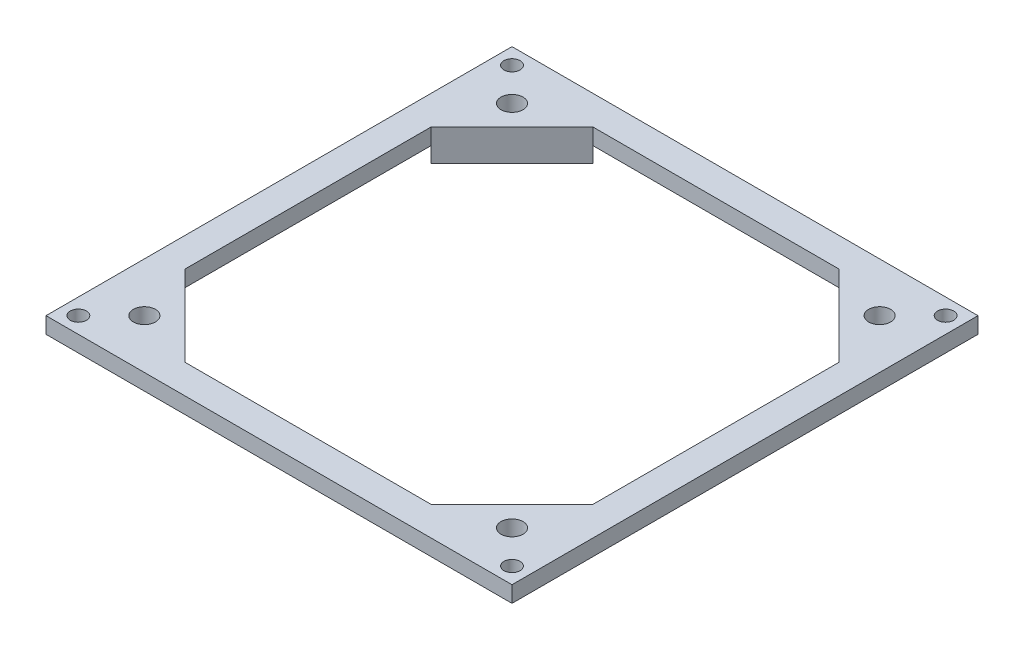
ISO-10303-21;
HEADER;
FILE_DESCRIPTION(('STEP AP214'),'2;1');
FILE_NAME('part.step','',(''),(''),'','','');
FILE_SCHEMA(('AUTOMOTIVE_DESIGN { 1 0 10303 214 1 1 1 1 }'));
ENDSEC;
DATA;
#1=APPLICATION_CONTEXT('core data for automotive mechanical design processes');
#2=APPLICATION_PROTOCOL_DEFINITION('international standard','automotive_design',2000,#1);
#3=PRODUCT_CONTEXT('',#1,'mechanical');
#4=PRODUCT('Part','Part','',(#3));
#5=PRODUCT_RELATED_PRODUCT_CATEGORY('part','',(#4));
#6=PRODUCT_DEFINITION_FORMATION('','',#4);
#7=PRODUCT_DEFINITION_CONTEXT('part definition',#1,'design');
#8=PRODUCT_DEFINITION('design','',#6,#7);
#9=PRODUCT_DEFINITION_SHAPE('','',#8);
#10=(LENGTH_UNIT() NAMED_UNIT(*) SI_UNIT(.MILLI.,.METRE.));
#11=(NAMED_UNIT(*) PLANE_ANGLE_UNIT() SI_UNIT($,.RADIAN.));
#12=(NAMED_UNIT(*) SI_UNIT($,.STERADIAN.) SOLID_ANGLE_UNIT());
#13=UNCERTAINTY_MEASURE_WITH_UNIT(LENGTH_MEASURE(1.E-05),#10,'distance_accuracy_value','');
#14=(GEOMETRIC_REPRESENTATION_CONTEXT(3) GLOBAL_UNCERTAINTY_ASSIGNED_CONTEXT((#13)) GLOBAL_UNIT_ASSIGNED_CONTEXT((#10,
#11,#12)) REPRESENTATION_CONTEXT('',''));
#15=CARTESIAN_POINT('',(0.,0.,0.));
#16=DIRECTION('',(0.,0.,1.));
#17=DIRECTION('',(1.,0.,0.));
#18=AXIS2_PLACEMENT_3D('',#15,#16,#17);
#19=CARTESIAN_POINT('',(40.005,-3.048,-40.005));
#20=DIRECTION('',(-1.,0.,0.));
#21=DIRECTION('',(0.,0.,1.));
#22=AXIS2_PLACEMENT_3D('',#19,#20,#21);
#23=PLANE('',#22);
#24=DIRECTION('',(0.,0.,1.));
#25=VECTOR('',#24,1.);
#26=CARTESIAN_POINT('',(40.005,0.,-40.005));
#27=LINE('',#26,#25);
#28=CARTESIAN_POINT('',(40.005,0.,24.13));
#29=VERTEX_POINT('',#28);
#30=CARTESIAN_POINT('',(40.005,0.,37.465));
#31=VERTEX_POINT('',#30);
#32=EDGE_CURVE('E319',#29,#31,#27,.T.);
#33=ORIENTED_EDGE('',*,*,#32,.T.);
#34=DIRECTION('',(0.,1.,0.));
#35=VECTOR('',#34,1.);
#36=CARTESIAN_POINT('',(40.005,-3.048,37.465));
#37=LINE('',#36,#35);
#38=CARTESIAN_POINT('',(40.005,-3.048,37.465));
#39=VERTEX_POINT('',#38);
#40=EDGE_CURVE('E417',#31,#39,#37,.F.);
#41=ORIENTED_EDGE('',*,*,#40,.T.);
#42=DIRECTION('',(0.,0.,1.));
#43=VECTOR('',#42,1.);
#44=CARTESIAN_POINT('',(40.005,-3.048,-40.005));
#45=LINE('',#44,#43);
#46=CARTESIAN_POINT('',(40.005,-3.048,24.13));
#47=VERTEX_POINT('',#46);
#48=EDGE_CURVE('E324',#47,#39,#45,.T.);
#49=ORIENTED_EDGE('',*,*,#48,.F.);
#50=DIRECTION('',(0.,-1.,0.));
#51=VECTOR('',#50,1.);
#52=CARTESIAN_POINT('',(40.005,3.175,24.13));
#53=LINE('',#52,#51);
#54=EDGE_CURVE('E286',#29,#47,#53,.T.);
#55=ORIENTED_EDGE('',*,*,#54,.F.);
#56=EDGE_LOOP('',(#33,#41,#49,#55));
#57=FACE_BOUND('',#56,.T.);
#58=ADVANCED_FACE('F39',(#57),#23,.F.);
#59=CARTESIAN_POINT('',(-40.005,-3.048,40.005));
#60=DIRECTION('',(0.,0.,-1.));
#61=DIRECTION('',(-1.,0.,0.));
#62=AXIS2_PLACEMENT_3D('',#59,#60,#61);
#63=PLANE('',#62);
#64=DIRECTION('',(-1.,0.,0.));
#65=VECTOR('',#64,1.);
#66=CARTESIAN_POINT('',(-40.005,-3.048,40.005));
#67=LINE('',#66,#65);
#68=CARTESIAN_POINT('',(37.465,-3.048,40.005));
#69=VERTEX_POINT('',#68);
#70=CARTESIAN_POINT('',(24.13,-3.048,40.005));
#71=VERTEX_POINT('',#70);
#72=EDGE_CURVE('E325',#69,#71,#67,.T.);
#73=ORIENTED_EDGE('',*,*,#72,.F.);
#74=DIRECTION('',(0.,1.,0.));
#75=VECTOR('',#74,1.);
#76=CARTESIAN_POINT('',(37.465,-3.048,40.005));
#77=LINE('',#76,#75);
#78=CARTESIAN_POINT('',(37.465,0.,40.005));
#79=VERTEX_POINT('',#78);
#80=EDGE_CURVE('E413',#69,#79,#77,.T.);
#81=ORIENTED_EDGE('',*,*,#80,.T.);
#82=DIRECTION('',(-1.,0.,0.));
#83=VECTOR('',#82,1.);
#84=CARTESIAN_POINT('',(-40.005,0.,40.005));
#85=LINE('',#84,#83);
#86=CARTESIAN_POINT('',(24.13,0.,40.005));
#87=VERTEX_POINT('',#86);
#88=EDGE_CURVE('E341',#79,#87,#85,.T.);
#89=ORIENTED_EDGE('',*,*,#88,.T.);
#90=DIRECTION('',(0.,-1.,0.));
#91=VECTOR('',#90,1.);
#92=CARTESIAN_POINT('',(24.13,3.175,40.005));
#93=LINE('',#92,#91);
#94=EDGE_CURVE('E281',#87,#71,#93,.T.);
#95=ORIENTED_EDGE('',*,*,#94,.T.);
#96=EDGE_LOOP('',(#73,#81,#89,#95));
#97=FACE_BOUND('',#96,.T.);
#98=ADVANCED_FACE('F568',(#97),#63,.F.);
#99=CARTESIAN_POINT('',(-40.005,-3.048,-40.005));
#100=DIRECTION('',(1.,0.,0.));
#101=DIRECTION('',(0.,0.,-1.));
#102=AXIS2_PLACEMENT_3D('',#99,#100,#101);
#103=PLANE('',#102);
#104=DIRECTION('',(0.,0.,-1.));
#105=VECTOR('',#104,1.);
#106=CARTESIAN_POINT('',(-40.005,0.,-40.005));
#107=LINE('',#106,#105);
#108=CARTESIAN_POINT('',(-40.005,0.,-24.13));
#109=VERTEX_POINT('',#108);
#110=CARTESIAN_POINT('',(-40.005,0.,-37.465));
#111=VERTEX_POINT('',#110);
#112=EDGE_CURVE('E344',#109,#111,#107,.T.);
#113=ORIENTED_EDGE('',*,*,#112,.T.);
#114=DIRECTION('',(0.,1.,0.));
#115=VECTOR('',#114,1.);
#116=CARTESIAN_POINT('',(-40.005,-3.048,-37.465));
#117=LINE('',#116,#115);
#118=CARTESIAN_POINT('',(-40.005,-3.048,-37.465));
#119=VERTEX_POINT('',#118);
#120=EDGE_CURVE('E397',#111,#119,#117,.F.);
#121=ORIENTED_EDGE('',*,*,#120,.T.);
#122=DIRECTION('',(0.,0.,-1.));
#123=VECTOR('',#122,1.);
#124=CARTESIAN_POINT('',(-40.005,-3.048,-40.005));
#125=LINE('',#124,#123);
#126=CARTESIAN_POINT('',(-40.005,-3.048,-24.13));
#127=VERTEX_POINT('',#126);
#128=EDGE_CURVE('E328',#127,#119,#125,.T.);
#129=ORIENTED_EDGE('',*,*,#128,.F.);
#130=DIRECTION('',(0.,-1.,0.));
#131=VECTOR('',#130,1.);
#132=CARTESIAN_POINT('',(-40.005,3.175,-24.13));
#133=LINE('',#132,#131);
#134=EDGE_CURVE('E306',#109,#127,#133,.T.);
#135=ORIENTED_EDGE('',*,*,#134,.F.);
#136=EDGE_LOOP('',(#113,#121,#129,#135));
#137=FACE_BOUND('',#136,.T.);
#138=ADVANCED_FACE('F583',(#137),#103,.F.);
#139=CARTESIAN_POINT('',(-40.005,-3.048,-40.005));
#140=DIRECTION('',(0.,0.,1.));
#141=DIRECTION('',(1.,0.,0.));
#142=AXIS2_PLACEMENT_3D('',#139,#140,#141);
#143=PLANE('',#142);
#144=DIRECTION('',(1.,0.,0.));
#145=VECTOR('',#144,1.);
#146=CARTESIAN_POINT('',(-40.005,0.,-40.005));
#147=LINE('',#146,#145);
#148=CARTESIAN_POINT('',(24.13,0.,-40.005));
#149=VERTEX_POINT('',#148);
#150=CARTESIAN_POINT('',(37.465,0.,-40.005));
#151=VERTEX_POINT('',#150);
#152=EDGE_CURVE('E348',#149,#151,#147,.T.);
#153=ORIENTED_EDGE('',*,*,#152,.T.);
#154=DIRECTION('',(0.,1.,0.));
#155=VECTOR('',#154,1.);
#156=CARTESIAN_POINT('',(37.465,-3.048,-40.005));
#157=LINE('',#156,#155);
#158=CARTESIAN_POINT('',(37.465,-3.048,-40.005));
#159=VERTEX_POINT('',#158);
#160=EDGE_CURVE('E407',#151,#159,#157,.F.);
#161=ORIENTED_EDGE('',*,*,#160,.T.);
#162=DIRECTION('',(1.,0.,0.));
#163=VECTOR('',#162,1.);
#164=CARTESIAN_POINT('',(-40.005,-3.048,-40.005));
#165=LINE('',#164,#163);
#166=CARTESIAN_POINT('',(24.13,-3.048,-40.005));
#167=VERTEX_POINT('',#166);
#168=EDGE_CURVE('E332',#167,#159,#165,.T.);
#169=ORIENTED_EDGE('',*,*,#168,.F.);
#170=DIRECTION('',(0.,-1.,0.));
#171=VECTOR('',#170,1.);
#172=CARTESIAN_POINT('',(24.13,3.175,-40.005));
#173=LINE('',#172,#171);
#174=EDGE_CURVE('E296',#149,#167,#173,.T.);
#175=ORIENTED_EDGE('',*,*,#174,.F.);
#176=EDGE_LOOP('',(#153,#161,#169,#175));
#177=FACE_BOUND('',#176,.T.);
#178=ADVANCED_FACE('F603',(#177),#143,.F.);
#179=CARTESIAN_POINT('',(0.,-3.048,0.));
#180=DIRECTION('',(0.,1.,0.));
#181=DIRECTION('',(0.,0.,1.));
#182=AXIS2_PLACEMENT_3D('',#179,#180,#181);
#183=PLANE('',#182);
#184=CARTESIAN_POINT('',(36.068,-3.048,36.068000000001));
#185=DIRECTION('',(0.,-1.,0.));
#186=DIRECTION('',(0.,0.,-1.));
#187=AXIS2_PLACEMENT_3D('',#184,#185,#186);
#188=CIRCLE('',#187,2.15900000000114);
#189=CARTESIAN_POINT('',(36.068,-3.048,33.9089999999999));
#190=VERTEX_POINT('',#189);
#191=EDGE_CURVE('E480',#190,#190,#188,.T.);
#192=ORIENTED_EDGE('',*,*,#191,.F.);
#193=EDGE_LOOP('',(#192));
#194=FACE_BOUND('',#193,.T.);
#195=ORIENTED_EDGE('',*,*,#48,.T.);
#196=CARTESIAN_POINT('',(37.465,-3.048,37.465));
#197=DIRECTION('',(0.,1.,0.));
#198=DIRECTION('',(0.,0.,1.));
#199=AXIS2_PLACEMENT_3D('',#196,#197,#198);
#200=CIRCLE('',#199,2.54);
#201=EDGE_CURVE('E420',#39,#69,#200,.F.);
#202=ORIENTED_EDGE('',*,*,#201,.T.);
#203=ORIENTED_EDGE('',*,*,#72,.T.);
#204=DIRECTION('',(-0.707106781186548,0.,0.707106781186548));
#205=VECTOR('',#204,1.);
#206=CARTESIAN_POINT('',(40.005,-3.048,24.13));
#207=LINE('',#206,#205);
#208=EDGE_CURVE('E237',#47,#71,#207,.T.);
#209=ORIENTED_EDGE('',*,*,#208,.F.);
#210=EDGE_LOOP('',(#195,#202,#203,#209));
#211=FACE_BOUND('',#210,.T.);
#212=ADVANCED_FACE('F503',(#194,#211),#183,.F.);
#213=CARTESIAN_POINT('',(36.068000000001,-3.048,-36.067999999999));
#214=DIRECTION('',(0.,-1.,0.));
#215=DIRECTION('',(0.,0.,-1.));
#216=AXIS2_PLACEMENT_3D('',#213,#214,#215);
#217=CIRCLE('',#216,2.15900000000161);
#218=CARTESIAN_POINT('',(36.068000000001,-3.048,-38.2270000000006));
#219=VERTEX_POINT('',#218);
#220=EDGE_CURVE('E466',#219,#219,#217,.T.);
#221=ORIENTED_EDGE('',*,*,#220,.F.);
#222=EDGE_LOOP('',(#221));
#223=FACE_BOUND('',#222,.T.);
#224=ORIENTED_EDGE('',*,*,#168,.T.);
#225=CARTESIAN_POINT('',(37.465,-3.048,-37.465));
#226=DIRECTION('',(0.,1.,0.));
#227=DIRECTION('',(0.,0.,1.));
#228=AXIS2_PLACEMENT_3D('',#225,#226,#227);
#229=CIRCLE('',#228,2.54);
#230=CARTESIAN_POINT('',(40.005,-3.048,-37.465));
#231=VERTEX_POINT('',#230);
#232=EDGE_CURVE('E410',#159,#231,#229,.F.);
#233=ORIENTED_EDGE('',*,*,#232,.T.);
#234=CARTESIAN_POINT('',(40.005,-3.048,-24.13));
#235=VERTEX_POINT('',#234);
#236=EDGE_CURVE('E320',#231,#235,#45,.T.);
#237=ORIENTED_EDGE('',*,*,#236,.T.);
#238=DIRECTION('',(0.707106781186548,0.,0.707106781186548));
#239=VECTOR('',#238,1.);
#240=CARTESIAN_POINT('',(24.13,-3.048,-40.005));
#241=LINE('',#240,#239);
#242=EDGE_CURVE('E241',#167,#235,#241,.T.);
#243=ORIENTED_EDGE('',*,*,#242,.F.);
#244=EDGE_LOOP('',(#224,#233,#237,#243));
#245=FACE_BOUND('',#244,.T.);
#246=ADVANCED_FACE('F499',(#223,#245),#183,.F.);
#247=CARTESIAN_POINT('',(-36.067999999999,-3.048,-36.068));
#248=DIRECTION('',(0.,-1.,0.));
#249=DIRECTION('',(0.,0.,-1.));
#250=AXIS2_PLACEMENT_3D('',#247,#248,#249);
#251=CIRCLE('',#250,2.15900000000077);
#252=CARTESIAN_POINT('',(-36.067999999999,-3.048,-38.2270000000007));
#253=VERTEX_POINT('',#252);
#254=EDGE_CURVE('E455',#253,#253,#251,.T.);
#255=ORIENTED_EDGE('',*,*,#254,.F.);
#256=EDGE_LOOP('',(#255));
#257=FACE_BOUND('',#256,.T.);
#258=ORIENTED_EDGE('',*,*,#128,.T.);
#259=CARTESIAN_POINT('',(-37.465,-3.048,-37.465));
#260=DIRECTION('',(0.,1.,0.));
#261=DIRECTION('',(0.,0.,1.));
#262=AXIS2_PLACEMENT_3D('',#259,#260,#261);
#263=CIRCLE('',#262,2.54);
#264=CARTESIAN_POINT('',(-37.465,-3.048,-40.005));
#265=VERTEX_POINT('',#264);
#266=EDGE_CURVE('E400',#119,#265,#263,.F.);
#267=ORIENTED_EDGE('',*,*,#266,.T.);
#268=CARTESIAN_POINT('',(-24.13,-3.048,-40.005));
#269=VERTEX_POINT('',#268);
#270=EDGE_CURVE('E333',#265,#269,#165,.T.);
#271=ORIENTED_EDGE('',*,*,#270,.T.);
#272=DIRECTION('',(0.707106781186548,0.,-0.707106781186547));
#273=VECTOR('',#272,1.);
#274=CARTESIAN_POINT('',(-40.005,-3.048,-24.13));
#275=LINE('',#274,#273);
#276=EDGE_CURVE('E269',#127,#269,#275,.T.);
#277=ORIENTED_EDGE('',*,*,#276,.F.);
#278=EDGE_LOOP('',(#258,#267,#271,#277));
#279=FACE_BOUND('',#278,.T.);
#280=ADVANCED_FACE('F502',(#257,#279),#183,.F.);
#281=CARTESIAN_POINT('',(45.72,3.175,45.72));
#282=DIRECTION('',(-1.,0.,0.));
#283=DIRECTION('',(0.,0.,1.));
#284=AXIS2_PLACEMENT_3D('',#281,#282,#283);
#285=PLANE('',#284);
#286=DIRECTION('',(0.,0.,-1.));
#287=VECTOR('',#286,1.);
#288=CARTESIAN_POINT('',(45.72,0.,45.72));
#289=LINE('',#288,#287);
#290=CARTESIAN_POINT('',(45.72,0.,45.72));
#291=VERTEX_POINT('',#290);
#292=CARTESIAN_POINT('',(45.72,0.,-45.72));
#293=VERTEX_POINT('',#292);
#294=EDGE_CURVE('E336',#291,#293,#289,.T.);
#295=ORIENTED_EDGE('',*,*,#294,.T.);
#296=DIRECTION('',(0.,-1.,0.));
#297=VECTOR('',#296,1.);
#298=CARTESIAN_POINT('',(45.72,3.175,-45.72));
#299=LINE('',#298,#297);
#300=CARTESIAN_POINT('',(45.72,3.175,-45.72));
#301=VERTEX_POINT('',#300);
#302=EDGE_CURVE('E389',#301,#293,#299,.T.);
#303=ORIENTED_EDGE('',*,*,#302,.F.);
#304=DIRECTION('',(0.,0.,-1.));
#305=VECTOR('',#304,1.);
#306=CARTESIAN_POINT('',(45.72,3.175,45.72));
#307=LINE('',#306,#305);
#308=CARTESIAN_POINT('',(45.72,3.175,45.72));
#309=VERTEX_POINT('',#308);
#310=EDGE_CURVE('E352',#309,#301,#307,.T.);
#311=ORIENTED_EDGE('',*,*,#310,.F.);
#312=DIRECTION('',(0.,-1.,0.));
#313=VECTOR('',#312,1.);
#314=CARTESIAN_POINT('',(45.72,3.175,45.72));
#315=LINE('',#314,#313);
#316=EDGE_CURVE('E366',#309,#291,#315,.T.);
#317=ORIENTED_EDGE('',*,*,#316,.T.);
#318=EDGE_LOOP('',(#295,#303,#311,#317));
#319=FACE_BOUND('',#318,.T.);
#320=ADVANCED_FACE('F646',(#319),#285,.F.);
#321=CARTESIAN_POINT('',(-45.72,3.175,-45.72));
#322=DIRECTION('',(0.,0.,1.));
#323=DIRECTION('',(1.,0.,0.));
#324=AXIS2_PLACEMENT_3D('',#321,#322,#323);
#325=PLANE('',#324);
#326=DIRECTION('',(-1.,0.,0.));
#327=VECTOR('',#326,1.);
#328=CARTESIAN_POINT('',(-45.72,0.,-45.72));
#329=LINE('',#328,#327);
#330=CARTESIAN_POINT('',(-45.72,0.,-45.72));
#331=VERTEX_POINT('',#330);
#332=EDGE_CURVE('E370',#293,#331,#329,.T.);
#333=ORIENTED_EDGE('',*,*,#332,.T.);
#334=DIRECTION('',(0.,-1.,0.));
#335=VECTOR('',#334,1.);
#336=CARTESIAN_POINT('',(-45.72,3.175,-45.72));
#337=LINE('',#336,#335);
#338=CARTESIAN_POINT('',(-45.72,3.175,-45.72));
#339=VERTEX_POINT('',#338);
#340=EDGE_CURVE('E385',#339,#331,#337,.T.);
#341=ORIENTED_EDGE('',*,*,#340,.F.);
#342=DIRECTION('',(-1.,0.,0.));
#343=VECTOR('',#342,1.);
#344=CARTESIAN_POINT('',(-45.72,3.175,-45.72));
#345=LINE('',#344,#343);
#346=EDGE_CURVE('E356',#301,#339,#345,.T.);
#347=ORIENTED_EDGE('',*,*,#346,.F.);
#348=ORIENTED_EDGE('',*,*,#302,.T.);
#349=EDGE_LOOP('',(#333,#341,#347,#348));
#350=FACE_BOUND('',#349,.T.);
#351=ADVANCED_FACE('F642',(#350),#325,.F.);
#352=CARTESIAN_POINT('',(-45.72,3.175,45.72));
#353=DIRECTION('',(1.,0.,0.));
#354=DIRECTION('',(0.,0.,-1.));
#355=AXIS2_PLACEMENT_3D('',#352,#353,#354);
#356=PLANE('',#355);
#357=DIRECTION('',(0.,0.,1.));
#358=VECTOR('',#357,1.);
#359=CARTESIAN_POINT('',(-45.72,0.,45.72));
#360=LINE('',#359,#358);
#361=CARTESIAN_POINT('',(-45.72,0.,45.72));
#362=VERTEX_POINT('',#361);
#363=EDGE_CURVE('E373',#331,#362,#360,.T.);
#364=ORIENTED_EDGE('',*,*,#363,.T.);
#365=DIRECTION('',(0.,-1.,0.));
#366=VECTOR('',#365,1.);
#367=CARTESIAN_POINT('',(-45.72,3.175,45.72));
#368=LINE('',#367,#366);
#369=CARTESIAN_POINT('',(-45.72,3.175,45.72));
#370=VERTEX_POINT('',#369);
#371=EDGE_CURVE('E381',#370,#362,#368,.T.);
#372=ORIENTED_EDGE('',*,*,#371,.F.);
#373=DIRECTION('',(0.,0.,1.));
#374=VECTOR('',#373,1.);
#375=CARTESIAN_POINT('',(-45.72,3.175,45.72));
#376=LINE('',#375,#374);
#377=EDGE_CURVE('E360',#339,#370,#376,.T.);
#378=ORIENTED_EDGE('',*,*,#377,.F.);
#379=ORIENTED_EDGE('',*,*,#340,.T.);
#380=EDGE_LOOP('',(#364,#372,#378,#379));
#381=FACE_BOUND('',#380,.T.);
#382=ADVANCED_FACE('F638',(#381),#356,.F.);
#383=CARTESIAN_POINT('',(-45.72,3.175,45.72));
#384=DIRECTION('',(0.,0.,-1.));
#385=DIRECTION('',(-1.,0.,0.));
#386=AXIS2_PLACEMENT_3D('',#383,#384,#385);
#387=PLANE('',#386);
#388=DIRECTION('',(1.,0.,0.));
#389=VECTOR('',#388,1.);
#390=CARTESIAN_POINT('',(-45.72,0.,45.72));
#391=LINE('',#390,#389);
#392=EDGE_CURVE('E357',#362,#291,#391,.T.);
#393=ORIENTED_EDGE('',*,*,#392,.T.);
#394=ORIENTED_EDGE('',*,*,#316,.F.);
#395=DIRECTION('',(1.,0.,0.));
#396=VECTOR('',#395,1.);
#397=CARTESIAN_POINT('',(-45.72,3.175,45.72));
#398=LINE('',#397,#396);
#399=EDGE_CURVE('E363',#370,#309,#398,.T.);
#400=ORIENTED_EDGE('',*,*,#399,.F.);
#401=ORIENTED_EDGE('',*,*,#371,.T.);
#402=EDGE_LOOP('',(#393,#394,#400,#401));
#403=FACE_BOUND('',#402,.T.);
#404=ADVANCED_FACE('F632',(#403),#387,.F.);
#405=CARTESIAN_POINT('',(0.,3.175,0.));
#406=DIRECTION('',(0.,-1.,0.));
#407=DIRECTION('',(0.,0.,-1.));
#408=AXIS2_PLACEMENT_3D('',#405,#406,#407);
#409=PLANE('',#408);
#410=CARTESIAN_POINT('',(-42.545,3.175,42.545));
#411=DIRECTION('',(0.,1.,0.));
#412=DIRECTION('',(0.,0.,1.));
#413=AXIS2_PLACEMENT_3D('',#410,#411,#412);
#414=CIRCLE('',#413,1.5875);
#415=CARTESIAN_POINT('',(-42.545,3.175,44.1325));
#416=VERTEX_POINT('',#415);
#417=EDGE_CURVE('E931',#416,#416,#414,.T.);
#418=ORIENTED_EDGE('',*,*,#417,.F.);
#419=EDGE_LOOP('',(#418));
#420=FACE_BOUND('',#419,.T.);
#421=CARTESIAN_POINT('',(42.545,3.175,42.545));
#422=DIRECTION('',(0.,1.,0.));
#423=DIRECTION('',(0.,0.,1.));
#424=AXIS2_PLACEMENT_3D('',#421,#422,#423);
#425=CIRCLE('',#424,1.5875);
#426=CARTESIAN_POINT('',(42.545,3.175,44.1325));
#427=VERTEX_POINT('',#426);
#428=EDGE_CURVE('E933',#427,#427,#425,.T.);
#429=ORIENTED_EDGE('',*,*,#428,.F.);
#430=EDGE_LOOP('',(#429));
#431=FACE_BOUND('',#430,.T.);
#432=CARTESIAN_POINT('',(42.545,3.175,-42.545));
#433=DIRECTION('',(0.,1.,0.));
#434=DIRECTION('',(0.,0.,1.));
#435=AXIS2_PLACEMENT_3D('',#432,#433,#434);
#436=CIRCLE('',#435,1.5875);
#437=CARTESIAN_POINT('',(42.545,3.175,-40.9575));
#438=VERTEX_POINT('',#437);
#439=EDGE_CURVE('E936',#438,#438,#436,.T.);
#440=ORIENTED_EDGE('',*,*,#439,.F.);
#441=EDGE_LOOP('',(#440));
#442=FACE_BOUND('',#441,.T.);
#443=CARTESIAN_POINT('',(-42.545,3.175,-42.545));
#444=DIRECTION('',(0.,1.,0.));
#445=DIRECTION('',(0.,0.,1.));
#446=AXIS2_PLACEMENT_3D('',#443,#444,#445);
#447=CIRCLE('',#446,1.5875);
#448=CARTESIAN_POINT('',(-42.545,3.175,-40.9575));
#449=VERTEX_POINT('',#448);
#450=EDGE_CURVE('E445',#449,#449,#447,.T.);
#451=ORIENTED_EDGE('',*,*,#450,.F.);
#452=EDGE_LOOP('',(#451));
#453=FACE_BOUND('',#452,.T.);
#454=CARTESIAN_POINT('',(-36.067999999999,3.175,-36.068));
#455=DIRECTION('',(0.,-1.,0.));
#456=DIRECTION('',(0.,0.,-1.));
#457=AXIS2_PLACEMENT_3D('',#454,#455,#456);
#458=CIRCLE('',#457,2.15900000000077);
#459=CARTESIAN_POINT('',(-36.067999999999,3.175,-38.2270000000007));
#460=VERTEX_POINT('',#459);
#461=EDGE_CURVE('E460',#460,#460,#458,.T.);
#462=ORIENTED_EDGE('',*,*,#461,.T.);
#463=EDGE_LOOP('',(#462));
#464=FACE_BOUND('',#463,.T.);
#465=CARTESIAN_POINT('',(36.068000000001,3.175,-36.067999999999));
#466=DIRECTION('',(0.,-1.,0.));
#467=DIRECTION('',(0.,0.,-1.));
#468=AXIS2_PLACEMENT_3D('',#465,#466,#467);
#469=CIRCLE('',#468,2.15900000000161);
#470=CARTESIAN_POINT('',(36.068000000001,3.175,-38.2270000000006));
#471=VERTEX_POINT('',#470);
#472=EDGE_CURVE('E486',#471,#471,#469,.T.);
#473=ORIENTED_EDGE('',*,*,#472,.T.);
#474=EDGE_LOOP('',(#473));
#475=FACE_BOUND('',#474,.T.);
#476=CARTESIAN_POINT('',(36.068,3.175,36.068000000001));
#477=DIRECTION('',(0.,-1.,0.));
#478=DIRECTION('',(0.,0.,-1.));
#479=AXIS2_PLACEMENT_3D('',#476,#477,#478);
#480=CIRCLE('',#479,2.15900000000114);
#481=CARTESIAN_POINT('',(36.068,3.175,33.9089999999999));
#482=VERTEX_POINT('',#481);
#483=EDGE_CURVE('E475',#482,#482,#480,.T.);
#484=ORIENTED_EDGE('',*,*,#483,.T.);
#485=EDGE_LOOP('',(#484));
#486=FACE_BOUND('',#485,.T.);
#487=CARTESIAN_POINT('',(-36.068,3.175,36.068));
#488=DIRECTION('',(0.,-1.,0.));
#489=DIRECTION('',(0.,0.,-1.));
#490=AXIS2_PLACEMENT_3D('',#487,#488,#489);
#491=CIRCLE('',#490,2.159);
#492=CARTESIAN_POINT('',(-36.068,3.175,33.909));
#493=VERTEX_POINT('',#492);
#494=EDGE_CURVE('E270',#493,#493,#491,.T.);
#495=ORIENTED_EDGE('',*,*,#494,.T.);
#496=EDGE_LOOP('',(#495));
#497=FACE_BOUND('',#496,.T.);
#498=DIRECTION('',(-0.707106781186548,0.,0.707106781186548));
#499=VECTOR('',#498,1.);
#500=CARTESIAN_POINT('',(40.005,3.175,24.13));
#501=LINE('',#500,#499);
#502=CARTESIAN_POINT('',(40.005,3.175,24.13));
#503=VERTEX_POINT('',#502);
#504=CARTESIAN_POINT('',(24.13,3.175,40.005));
#505=VERTEX_POINT('',#504);
#506=EDGE_CURVE('E235',#503,#505,#501,.T.);
#507=ORIENTED_EDGE('',*,*,#506,.T.);
#508=DIRECTION('',(-1.,0.,0.));
#509=VECTOR('',#508,1.);
#510=CARTESIAN_POINT('',(24.13,3.175,40.005));
#511=LINE('',#510,#509);
#512=CARTESIAN_POINT('',(-24.13,3.175,40.005));
#513=VERTEX_POINT('',#512);
#514=EDGE_CURVE('E208',#505,#513,#511,.T.);
#515=ORIENTED_EDGE('',*,*,#514,.T.);
#516=DIRECTION('',(-0.707106781186548,0.,-0.707106781186548));
#517=VECTOR('',#516,1.);
#518=CARTESIAN_POINT('',(-24.13,3.175,40.005));
#519=LINE('',#518,#517);
#520=CARTESIAN_POINT('',(-40.005,3.175,24.13));
#521=VERTEX_POINT('',#520);
#522=EDGE_CURVE('E220',#513,#521,#519,.T.);
#523=ORIENTED_EDGE('',*,*,#522,.T.);
#524=DIRECTION('',(0.,0.,-1.));
#525=VECTOR('',#524,1.);
#526=CARTESIAN_POINT('',(-40.005,3.175,24.13));
#527=LINE('',#526,#525);
#528=CARTESIAN_POINT('',(-40.005,3.175,-24.13));
#529=VERTEX_POINT('',#528);
#530=EDGE_CURVE('E229',#521,#529,#527,.T.);
#531=ORIENTED_EDGE('',*,*,#530,.T.);
#532=DIRECTION('',(0.707106781186548,0.,-0.707106781186547));
#533=VECTOR('',#532,1.);
#534=CARTESIAN_POINT('',(-40.005,3.175,-24.13));
#535=LINE('',#534,#533);
#536=CARTESIAN_POINT('',(-24.13,3.175,-40.005));
#537=VERTEX_POINT('',#536);
#538=EDGE_CURVE('E249',#529,#537,#535,.T.);
#539=ORIENTED_EDGE('',*,*,#538,.T.);
#540=DIRECTION('',(1.,0.,0.));
#541=VECTOR('',#540,1.);
#542=CARTESIAN_POINT('',(-24.13,3.175,-40.005));
#543=LINE('',#542,#541);
#544=CARTESIAN_POINT('',(24.13,3.175,-40.005));
#545=VERTEX_POINT('',#544);
#546=EDGE_CURVE('E253',#537,#545,#543,.T.);
#547=ORIENTED_EDGE('',*,*,#546,.T.);
#548=DIRECTION('',(0.707106781186548,0.,0.707106781186548));
#549=VECTOR('',#548,1.);
#550=CARTESIAN_POINT('',(24.13,3.175,-40.005));
#551=LINE('',#550,#549);
#552=CARTESIAN_POINT('',(40.005,3.175,-24.13));
#553=VERTEX_POINT('',#552);
#554=EDGE_CURVE('E257',#545,#553,#551,.T.);
#555=ORIENTED_EDGE('',*,*,#554,.T.);
#556=DIRECTION('',(0.,0.,1.));
#557=VECTOR('',#556,1.);
#558=CARTESIAN_POINT('',(40.005,3.175,-24.13));
#559=LINE('',#558,#557);
#560=EDGE_CURVE('E261',#553,#503,#559,.T.);
#561=ORIENTED_EDGE('',*,*,#560,.T.);
#562=EDGE_LOOP('',(#507,#515,#523,#531,#539,#547,#555,#561));
#563=FACE_BOUND('',#562,.T.);
#564=ORIENTED_EDGE('',*,*,#310,.T.);
#565=ORIENTED_EDGE('',*,*,#346,.T.);
#566=ORIENTED_EDGE('',*,*,#377,.T.);
#567=ORIENTED_EDGE('',*,*,#399,.T.);
#568=EDGE_LOOP('',(#564,#565,#566,#567));
#569=FACE_BOUND('',#568,.T.);
#570=ADVANCED_FACE('F231',(#420,#431,#442,#453,#464,#475,#486,#497,#563,#569),#409,.F.);
#571=CARTESIAN_POINT('',(0.,0.,0.));
#572=DIRECTION('',(0.,-1.,0.));
#573=DIRECTION('',(0.,0.,-1.));
#574=AXIS2_PLACEMENT_3D('',#571,#572,#573);
#575=PLANE('',#574);
#576=CARTESIAN_POINT('',(-42.545,0.,42.545));
#577=DIRECTION('',(0.,-1.,0.));
#578=DIRECTION('',(0.,0.,-1.));
#579=AXIS2_PLACEMENT_3D('',#576,#577,#578);
#580=CIRCLE('',#579,1.5875);
#581=CARTESIAN_POINT('',(-42.545,0.,40.9575));
#582=VERTEX_POINT('',#581);
#583=EDGE_CURVE('E43',#582,#582,#580,.T.);
#584=ORIENTED_EDGE('',*,*,#583,.F.);
#585=EDGE_LOOP('',(#584));
#586=FACE_BOUND('',#585,.T.);
#587=CARTESIAN_POINT('',(42.545,0.,42.545));
#588=DIRECTION('',(0.,-1.,0.));
#589=DIRECTION('',(0.,0.,-1.));
#590=AXIS2_PLACEMENT_3D('',#587,#588,#589);
#591=CIRCLE('',#590,1.5875);
#592=CARTESIAN_POINT('',(42.545,0.,40.9575));
#593=VERTEX_POINT('',#592);
#594=EDGE_CURVE('E448',#593,#593,#591,.T.);
#595=ORIENTED_EDGE('',*,*,#594,.F.);
#596=EDGE_LOOP('',(#595));
#597=FACE_BOUND('',#596,.T.);
#598=CARTESIAN_POINT('',(42.545,0.,-42.545));
#599=DIRECTION('',(0.,-1.,0.));
#600=DIRECTION('',(0.,0.,-1.));
#601=AXIS2_PLACEMENT_3D('',#598,#599,#600);
#602=CIRCLE('',#601,1.5875);
#603=CARTESIAN_POINT('',(42.545,0.,-44.1325));
#604=VERTEX_POINT('',#603);
#605=EDGE_CURVE('E444',#604,#604,#602,.T.);
#606=ORIENTED_EDGE('',*,*,#605,.F.);
#607=EDGE_LOOP('',(#606));
#608=FACE_BOUND('',#607,.T.);
#609=CARTESIAN_POINT('',(-42.545,0.,-42.545));
#610=DIRECTION('',(0.,-1.,0.));
#611=DIRECTION('',(0.,0.,-1.));
#612=AXIS2_PLACEMENT_3D('',#609,#610,#611);
#613=CIRCLE('',#612,1.5875);
#614=CARTESIAN_POINT('',(-42.545,0.,-44.1325));
#615=VERTEX_POINT('',#614);
#616=EDGE_CURVE('E440',#615,#615,#613,.T.);
#617=ORIENTED_EDGE('',*,*,#616,.F.);
#618=EDGE_LOOP('',(#617));
#619=FACE_BOUND('',#618,.T.);
#620=CARTESIAN_POINT('',(40.005,0.,-37.465));
#621=VERTEX_POINT('',#620);
#622=CARTESIAN_POINT('',(40.005,0.,-24.13));
#623=VERTEX_POINT('',#622);
#624=EDGE_CURVE('E337',#621,#623,#27,.T.);
#625=ORIENTED_EDGE('',*,*,#624,.F.);
#626=CARTESIAN_POINT('',(37.465,0.,-37.465));
#627=DIRECTION('',(0.,-1.,0.));
#628=DIRECTION('',(0.,0.,-1.));
#629=AXIS2_PLACEMENT_3D('',#626,#627,#628);
#630=CIRCLE('',#629,2.54);
#631=EDGE_CURVE('E435',#621,#151,#630,.F.);
#632=ORIENTED_EDGE('',*,*,#631,.T.);
#633=ORIENTED_EDGE('',*,*,#152,.F.);
#634=DIRECTION('',(1.,0.,0.));
#635=VECTOR('',#634,1.);
#636=CARTESIAN_POINT('',(0.,0.,-40.005));
#637=LINE('',#636,#635);
#638=CARTESIAN_POINT('',(-24.13,0.,-40.005));
#639=VERTEX_POINT('',#638);
#640=EDGE_CURVE('E311',#639,#149,#637,.T.);
#641=ORIENTED_EDGE('',*,*,#640,.F.);
#642=CARTESIAN_POINT('',(-37.465,0.,-40.005));
#643=VERTEX_POINT('',#642);
#644=EDGE_CURVE('E349',#643,#639,#147,.T.);
#645=ORIENTED_EDGE('',*,*,#644,.F.);
#646=CARTESIAN_POINT('',(-37.465,0.,-37.465));
#647=DIRECTION('',(0.,-1.,0.));
#648=DIRECTION('',(0.,0.,-1.));
#649=AXIS2_PLACEMENT_3D('',#646,#647,#648);
#650=CIRCLE('',#649,2.54);
#651=EDGE_CURVE('E432',#643,#111,#650,.F.);
#652=ORIENTED_EDGE('',*,*,#651,.T.);
#653=ORIENTED_EDGE('',*,*,#112,.F.);
#654=DIRECTION('',(0.,0.,-1.));
#655=VECTOR('',#654,1.);
#656=CARTESIAN_POINT('',(-40.005,0.,0.));
#657=LINE('',#656,#655);
#658=CARTESIAN_POINT('',(-40.005,0.,24.13));
#659=VERTEX_POINT('',#658);
#660=EDGE_CURVE('E280',#659,#109,#657,.T.);
#661=ORIENTED_EDGE('',*,*,#660,.F.);
#662=CARTESIAN_POINT('',(-40.005,0.,37.465));
#663=VERTEX_POINT('',#662);
#664=EDGE_CURVE('E345',#663,#659,#107,.T.);
#665=ORIENTED_EDGE('',*,*,#664,.F.);
#666=CARTESIAN_POINT('',(-37.465,0.,37.465));
#667=DIRECTION('',(0.,-1.,0.));
#668=DIRECTION('',(0.,0.,-1.));
#669=AXIS2_PLACEMENT_3D('',#666,#667,#668);
#670=CIRCLE('',#669,2.54);
#671=CARTESIAN_POINT('',(-37.465,0.,40.005));
#672=VERTEX_POINT('',#671);
#673=EDGE_CURVE('E11',#663,#672,#670,.F.);
#674=ORIENTED_EDGE('',*,*,#673,.T.);
#675=CARTESIAN_POINT('',(-24.13,0.,40.005));
#676=VERTEX_POINT('',#675);
#677=EDGE_CURVE('E340',#676,#672,#85,.T.);
#678=ORIENTED_EDGE('',*,*,#677,.F.);
#679=DIRECTION('',(-1.,0.,0.));
#680=VECTOR('',#679,1.);
#681=CARTESIAN_POINT('',(0.,0.,40.005));
#682=LINE('',#681,#680);
#683=EDGE_CURVE('E211',#87,#676,#682,.T.);
#684=ORIENTED_EDGE('',*,*,#683,.F.);
#685=ORIENTED_EDGE('',*,*,#88,.F.);
#686=CARTESIAN_POINT('',(37.465,0.,37.465));
#687=DIRECTION('',(0.,-1.,0.));
#688=DIRECTION('',(0.,0.,-1.));
#689=AXIS2_PLACEMENT_3D('',#686,#687,#688);
#690=CIRCLE('',#689,2.54);
#691=EDGE_CURVE('E49',#79,#31,#690,.F.);
#692=ORIENTED_EDGE('',*,*,#691,.T.);
#693=ORIENTED_EDGE('',*,*,#32,.F.);
#694=DIRECTION('',(0.,0.,1.));
#695=VECTOR('',#694,1.);
#696=CARTESIAN_POINT('',(40.005,0.,0.));
#697=LINE('',#696,#695);
#698=EDGE_CURVE('E314',#623,#29,#697,.T.);
#699=ORIENTED_EDGE('',*,*,#698,.F.);
#700=EDGE_LOOP('',(#625,#632,#633,#641,#645,#652,#653,#661,#665,#674,#678,#684,#685,#692,#693,#699));
#701=FACE_BOUND('',#700,.T.);
#702=ORIENTED_EDGE('',*,*,#294,.F.);
#703=ORIENTED_EDGE('',*,*,#392,.F.);
#704=ORIENTED_EDGE('',*,*,#363,.F.);
#705=ORIENTED_EDGE('',*,*,#332,.F.);
#706=EDGE_LOOP('',(#702,#703,#704,#705));
#707=FACE_BOUND('',#706,.T.);
#708=ADVANCED_FACE('F523',(#586,#597,#608,#619,#701,#707),#575,.T.);
#709=ORIENTED_EDGE('',*,*,#236,.F.);
#710=DIRECTION('',(0.,1.,0.));
#711=VECTOR('',#710,1.);
#712=CARTESIAN_POINT('',(40.005,-3.048,-37.465));
#713=LINE('',#712,#711);
#714=EDGE_CURVE('E403',#231,#621,#713,.T.);
#715=ORIENTED_EDGE('',*,*,#714,.T.);
#716=ORIENTED_EDGE('',*,*,#624,.T.);
#717=DIRECTION('',(0.,-1.,0.));
#718=VECTOR('',#717,1.);
#719=CARTESIAN_POINT('',(40.005,3.175,-24.13));
#720=LINE('',#719,#718);
#721=EDGE_CURVE('E291',#623,#235,#720,.T.);
#722=ORIENTED_EDGE('',*,*,#721,.T.);
#723=EDGE_LOOP('',(#709,#715,#716,#722));
#724=FACE_BOUND('',#723,.T.);
#725=ADVANCED_FACE('F519',(#724),#23,.F.);
#726=ORIENTED_EDGE('',*,*,#677,.T.);
#727=DIRECTION('',(0.,1.,0.));
#728=VECTOR('',#727,1.);
#729=CARTESIAN_POINT('',(-37.465,-3.048,40.005));
#730=LINE('',#729,#728);
#731=CARTESIAN_POINT('',(-37.465,-3.048,40.005));
#732=VERTEX_POINT('',#731);
#733=EDGE_CURVE('E62',#672,#732,#730,.F.);
#734=ORIENTED_EDGE('',*,*,#733,.T.);
#735=CARTESIAN_POINT('',(-24.13,-3.048,40.005));
#736=VERTEX_POINT('',#735);
#737=EDGE_CURVE('E323',#736,#732,#67,.T.);
#738=ORIENTED_EDGE('',*,*,#737,.F.);
#739=DIRECTION('',(0.,-1.,0.));
#740=VECTOR('',#739,1.);
#741=CARTESIAN_POINT('',(-24.13,3.175,40.005));
#742=LINE('',#741,#740);
#743=EDGE_CURVE('E216',#676,#736,#742,.T.);
#744=ORIENTED_EDGE('',*,*,#743,.F.);
#745=EDGE_LOOP('',(#726,#734,#738,#744));
#746=FACE_BOUND('',#745,.T.);
#747=ADVANCED_FACE('F555',(#746),#63,.F.);
#748=CARTESIAN_POINT('',(-40.005,-3.048,37.465));
#749=VERTEX_POINT('',#748);
#750=CARTESIAN_POINT('',(-40.005,-3.048,24.13));
#751=VERTEX_POINT('',#750);
#752=EDGE_CURVE('E329',#749,#751,#125,.T.);
#753=ORIENTED_EDGE('',*,*,#752,.F.);
#754=DIRECTION('',(0.,1.,0.));
#755=VECTOR('',#754,1.);
#756=CARTESIAN_POINT('',(-40.005,-3.048,37.465));
#757=LINE('',#756,#755);
#758=EDGE_CURVE('E423',#749,#663,#757,.T.);
#759=ORIENTED_EDGE('',*,*,#758,.T.);
#760=ORIENTED_EDGE('',*,*,#664,.T.);
#761=DIRECTION('',(0.,-1.,0.));
#762=VECTOR('',#761,1.);
#763=CARTESIAN_POINT('',(-40.005,3.175,24.13));
#764=LINE('',#763,#762);
#765=EDGE_CURVE('E215',#659,#751,#764,.T.);
#766=ORIENTED_EDGE('',*,*,#765,.T.);
#767=EDGE_LOOP('',(#753,#759,#760,#766));
#768=FACE_BOUND('',#767,.T.);
#769=ADVANCED_FACE('F574',(#768),#103,.F.);
#770=ORIENTED_EDGE('',*,*,#270,.F.);
#771=DIRECTION('',(0.,1.,0.));
#772=VECTOR('',#771,1.);
#773=CARTESIAN_POINT('',(-37.465,-3.048,-40.005));
#774=LINE('',#773,#772);
#775=EDGE_CURVE('E393',#265,#643,#774,.T.);
#776=ORIENTED_EDGE('',*,*,#775,.T.);
#777=ORIENTED_EDGE('',*,*,#644,.T.);
#778=DIRECTION('',(0.,-1.,0.));
#779=VECTOR('',#778,1.);
#780=CARTESIAN_POINT('',(-24.13,3.175,-40.005));
#781=LINE('',#780,#779);
#782=EDGE_CURVE('E301',#639,#269,#781,.T.);
#783=ORIENTED_EDGE('',*,*,#782,.T.);
#784=EDGE_LOOP('',(#770,#776,#777,#783));
#785=FACE_BOUND('',#784,.T.);
#786=ADVANCED_FACE('F594',(#785),#143,.F.);
#787=CARTESIAN_POINT('',(-36.068,-3.048,36.068));
#788=DIRECTION('',(0.,-1.,0.));
#789=DIRECTION('',(0.,0.,-1.));
#790=AXIS2_PLACEMENT_3D('',#787,#788,#789);
#791=CIRCLE('',#790,2.159);
#792=CARTESIAN_POINT('',(-36.068,-3.048,33.909));
#793=VERTEX_POINT('',#792);
#794=EDGE_CURVE('E244',#793,#793,#791,.T.);
#795=ORIENTED_EDGE('',*,*,#794,.F.);
#796=EDGE_LOOP('',(#795));
#797=FACE_BOUND('',#796,.T.);
#798=ORIENTED_EDGE('',*,*,#737,.T.);
#799=CARTESIAN_POINT('',(-37.465,-3.048,37.465));
#800=DIRECTION('',(0.,1.,0.));
#801=DIRECTION('',(0.,0.,1.));
#802=AXIS2_PLACEMENT_3D('',#799,#800,#801);
#803=CIRCLE('',#802,2.54);
#804=EDGE_CURVE('E429',#732,#749,#803,.F.);
#805=ORIENTED_EDGE('',*,*,#804,.T.);
#806=ORIENTED_EDGE('',*,*,#752,.T.);
#807=DIRECTION('',(-0.707106781186548,0.,-0.707106781186548));
#808=VECTOR('',#807,1.);
#809=CARTESIAN_POINT('',(-24.13,-3.048,40.005));
#810=LINE('',#809,#808);
#811=EDGE_CURVE('E266',#736,#751,#810,.T.);
#812=ORIENTED_EDGE('',*,*,#811,.F.);
#813=EDGE_LOOP('',(#798,#805,#806,#812));
#814=FACE_BOUND('',#813,.T.);
#815=ADVANCED_FACE('F552',(#797,#814),#183,.F.);
#816=CARTESIAN_POINT('',(24.13,3.175,40.005));
#817=DIRECTION('',(0.,0.,1.));
#818=DIRECTION('',(1.,0.,0.));
#819=AXIS2_PLACEMENT_3D('',#816,#817,#818);
#820=PLANE('',#819);
#821=ORIENTED_EDGE('',*,*,#683,.T.);
#822=EDGE_CURVE('E203',#513,#676,#742,.T.);
#823=ORIENTED_EDGE('',*,*,#822,.F.);
#824=ORIENTED_EDGE('',*,*,#514,.F.);
#825=EDGE_CURVE('E277',#505,#87,#93,.T.);
#826=ORIENTED_EDGE('',*,*,#825,.T.);
#827=EDGE_LOOP('',(#821,#823,#824,#826));
#828=FACE_BOUND('',#827,.T.);
#829=ADVANCED_FACE('F205',(#828),#820,.F.);
#830=CARTESIAN_POINT('',(40.005,3.175,24.13));
#831=DIRECTION('',(0.707106781186547,0.,0.707106781186547));
#832=DIRECTION('',(0.707106781186548,0.,-0.707106781186548));
#833=AXIS2_PLACEMENT_3D('',#830,#831,#832);
#834=PLANE('',#833);
#835=ORIENTED_EDGE('',*,*,#208,.T.);
#836=ORIENTED_EDGE('',*,*,#94,.F.);
#837=ORIENTED_EDGE('',*,*,#825,.F.);
#838=ORIENTED_EDGE('',*,*,#506,.F.);
#839=EDGE_CURVE('E282',#503,#29,#53,.T.);
#840=ORIENTED_EDGE('',*,*,#839,.T.);
#841=ORIENTED_EDGE('',*,*,#54,.T.);
#842=EDGE_LOOP('',(#835,#836,#837,#838,#840,#841));
#843=FACE_BOUND('',#842,.T.);
#844=ADVANCED_FACE('F534',(#843),#834,.F.);
#845=CARTESIAN_POINT('',(40.005,3.175,-24.13));
#846=DIRECTION('',(1.,0.,0.));
#847=DIRECTION('',(0.,0.,-1.));
#848=AXIS2_PLACEMENT_3D('',#845,#846,#847);
#849=PLANE('',#848);
#850=ORIENTED_EDGE('',*,*,#698,.T.);
#851=ORIENTED_EDGE('',*,*,#839,.F.);
#852=ORIENTED_EDGE('',*,*,#560,.F.);
#853=EDGE_CURVE('E287',#553,#623,#720,.T.);
#854=ORIENTED_EDGE('',*,*,#853,.T.);
#855=EDGE_LOOP('',(#850,#851,#852,#854));
#856=FACE_BOUND('',#855,.T.);
#857=ADVANCED_FACE('F530',(#856),#849,.F.);
#858=CARTESIAN_POINT('',(24.13,3.175,-40.005));
#859=DIRECTION('',(0.707106781186547,0.,-0.707106781186547));
#860=DIRECTION('',(-0.707106781186548,0.,-0.707106781186548));
#861=AXIS2_PLACEMENT_3D('',#858,#859,#860);
#862=PLANE('',#861);
#863=ORIENTED_EDGE('',*,*,#242,.T.);
#864=ORIENTED_EDGE('',*,*,#721,.F.);
#865=ORIENTED_EDGE('',*,*,#853,.F.);
#866=ORIENTED_EDGE('',*,*,#554,.F.);
#867=EDGE_CURVE('E292',#545,#149,#173,.T.);
#868=ORIENTED_EDGE('',*,*,#867,.T.);
#869=ORIENTED_EDGE('',*,*,#174,.T.);
#870=EDGE_LOOP('',(#863,#864,#865,#866,#868,#869));
#871=FACE_BOUND('',#870,.T.);
#872=ADVANCED_FACE('F605',(#871),#862,.F.);
#873=CARTESIAN_POINT('',(-24.13,3.175,-40.005));
#874=DIRECTION('',(0.,0.,-1.));
#875=DIRECTION('',(-1.,0.,0.));
#876=AXIS2_PLACEMENT_3D('',#873,#874,#875);
#877=PLANE('',#876);
#878=ORIENTED_EDGE('',*,*,#640,.T.);
#879=ORIENTED_EDGE('',*,*,#867,.F.);
#880=ORIENTED_EDGE('',*,*,#546,.F.);
#881=EDGE_CURVE('E297',#537,#639,#781,.T.);
#882=ORIENTED_EDGE('',*,*,#881,.T.);
#883=EDGE_LOOP('',(#878,#879,#880,#882));
#884=FACE_BOUND('',#883,.T.);
#885=ADVANCED_FACE('F602',(#884),#877,.F.);
#886=CARTESIAN_POINT('',(-40.005,3.175,-24.13));
#887=DIRECTION('',(-0.707106781186547,0.,-0.707106781186548));
#888=DIRECTION('',(-0.707106781186548,0.,0.707106781186547));
#889=AXIS2_PLACEMENT_3D('',#886,#887,#888);
#890=PLANE('',#889);
#891=ORIENTED_EDGE('',*,*,#276,.T.);
#892=ORIENTED_EDGE('',*,*,#782,.F.);
#893=ORIENTED_EDGE('',*,*,#881,.F.);
#894=ORIENTED_EDGE('',*,*,#538,.F.);
#895=EDGE_CURVE('E302',#529,#109,#133,.T.);
#896=ORIENTED_EDGE('',*,*,#895,.T.);
#897=ORIENTED_EDGE('',*,*,#134,.T.);
#898=EDGE_LOOP('',(#891,#892,#893,#894,#896,#897));
#899=FACE_BOUND('',#898,.T.);
#900=ADVANCED_FACE('F597',(#899),#890,.F.);
#901=CARTESIAN_POINT('',(-40.005,3.175,24.13));
#902=DIRECTION('',(-1.,0.,0.));
#903=DIRECTION('',(0.,0.,1.));
#904=AXIS2_PLACEMENT_3D('',#901,#902,#903);
#905=PLANE('',#904);
#906=ORIENTED_EDGE('',*,*,#660,.T.);
#907=ORIENTED_EDGE('',*,*,#895,.F.);
#908=ORIENTED_EDGE('',*,*,#530,.F.);
#909=EDGE_CURVE('E225',#521,#659,#764,.T.);
#910=ORIENTED_EDGE('',*,*,#909,.T.);
#911=EDGE_LOOP('',(#906,#907,#908,#910));
#912=FACE_BOUND('',#911,.T.);
#913=ADVANCED_FACE('F577',(#912),#905,.F.);
#914=CARTESIAN_POINT('',(-24.13,3.175,40.005));
#915=DIRECTION('',(-0.707106781186547,0.,0.707106781186547));
#916=DIRECTION('',(0.707106781186548,0.,0.707106781186548));
#917=AXIS2_PLACEMENT_3D('',#914,#915,#916);
#918=PLANE('',#917);
#919=ORIENTED_EDGE('',*,*,#811,.T.);
#920=ORIENTED_EDGE('',*,*,#765,.F.);
#921=ORIENTED_EDGE('',*,*,#909,.F.);
#922=ORIENTED_EDGE('',*,*,#522,.F.);
#923=ORIENTED_EDGE('',*,*,#822,.T.);
#924=ORIENTED_EDGE('',*,*,#743,.T.);
#925=EDGE_LOOP('',(#919,#920,#921,#922,#923,#924));
#926=FACE_BOUND('',#925,.T.);
#927=ADVANCED_FACE('F222',(#926),#918,.F.);
#928=CARTESIAN_POINT('',(-36.068,3.175,36.068));
#929=DIRECTION('',(0.,-1.,0.));
#930=DIRECTION('',(0.,0.,-1.));
#931=AXIS2_PLACEMENT_3D('',#928,#929,#930);
#932=CYLINDRICAL_SURFACE('',#931,2.159);
#933=ORIENTED_EDGE('',*,*,#494,.F.);
#934=EDGE_LOOP('',(#933));
#935=FACE_BOUND('',#934,.T.);
#936=ORIENTED_EDGE('',*,*,#794,.T.);
#937=EDGE_LOOP('',(#936));
#938=FACE_BOUND('',#937,.T.);
#939=ADVANCED_FACE('F759',(#935,#938),#932,.F.);
#940=CARTESIAN_POINT('',(36.068,3.175,36.068000000001));
#941=DIRECTION('',(0.,-1.,0.));
#942=DIRECTION('',(0.,0.,-1.));
#943=AXIS2_PLACEMENT_3D('',#940,#941,#942);
#944=CYLINDRICAL_SURFACE('',#943,2.15900000000114);
#945=ORIENTED_EDGE('',*,*,#483,.F.);
#946=EDGE_LOOP('',(#945));
#947=FACE_BOUND('',#946,.T.);
#948=ORIENTED_EDGE('',*,*,#191,.T.);
#949=EDGE_LOOP('',(#948));
#950=FACE_BOUND('',#949,.T.);
#951=ADVANCED_FACE('F756',(#947,#950),#944,.F.);
#952=CARTESIAN_POINT('',(36.068000000001,3.175,-36.067999999999));
#953=DIRECTION('',(0.,-1.,0.));
#954=DIRECTION('',(0.,0.,-1.));
#955=AXIS2_PLACEMENT_3D('',#952,#953,#954);
#956=CYLINDRICAL_SURFACE('',#955,2.15900000000161);
#957=ORIENTED_EDGE('',*,*,#472,.F.);
#958=EDGE_LOOP('',(#957));
#959=FACE_BOUND('',#958,.T.);
#960=ORIENTED_EDGE('',*,*,#220,.T.);
#961=EDGE_LOOP('',(#960));
#962=FACE_BOUND('',#961,.T.);
#963=ADVANCED_FACE('F497',(#959,#962),#956,.F.);
#964=CARTESIAN_POINT('',(-36.067999999999,3.175,-36.068));
#965=DIRECTION('',(0.,-1.,0.));
#966=DIRECTION('',(0.,0.,-1.));
#967=AXIS2_PLACEMENT_3D('',#964,#965,#966);
#968=CYLINDRICAL_SURFACE('',#967,2.15900000000077);
#969=ORIENTED_EDGE('',*,*,#461,.F.);
#970=EDGE_LOOP('',(#969));
#971=FACE_BOUND('',#970,.T.);
#972=ORIENTED_EDGE('',*,*,#254,.T.);
#973=EDGE_LOOP('',(#972));
#974=FACE_BOUND('',#973,.T.);
#975=ADVANCED_FACE('F653',(#971,#974),#968,.F.);
#976=CARTESIAN_POINT('',(-37.465,-3.048,-37.465));
#977=DIRECTION('',(0.,1.,0.));
#978=DIRECTION('',(0.,0.,1.));
#979=AXIS2_PLACEMENT_3D('',#976,#977,#978);
#980=CYLINDRICAL_SURFACE('',#979,2.54);
#981=ORIENTED_EDGE('',*,*,#266,.F.);
#982=ORIENTED_EDGE('',*,*,#120,.F.);
#983=ORIENTED_EDGE('',*,*,#651,.F.);
#984=ORIENTED_EDGE('',*,*,#775,.F.);
#985=EDGE_LOOP('',(#981,#982,#983,#984));
#986=FACE_BOUND('',#985,.T.);
#987=ADVANCED_FACE('F588',(#986),#980,.T.);
#988=CARTESIAN_POINT('',(37.465,-3.048,-37.465));
#989=DIRECTION('',(0.,1.,0.));
#990=DIRECTION('',(0.,0.,1.));
#991=AXIS2_PLACEMENT_3D('',#988,#989,#990);
#992=CYLINDRICAL_SURFACE('',#991,2.54);
#993=ORIENTED_EDGE('',*,*,#232,.F.);
#994=ORIENTED_EDGE('',*,*,#160,.F.);
#995=ORIENTED_EDGE('',*,*,#631,.F.);
#996=ORIENTED_EDGE('',*,*,#714,.F.);
#997=EDGE_LOOP('',(#993,#994,#995,#996));
#998=FACE_BOUND('',#997,.T.);
#999=ADVANCED_FACE('F516',(#998),#992,.T.);
#1000=CARTESIAN_POINT('',(37.465,-3.048,37.465));
#1001=DIRECTION('',(0.,1.,0.));
#1002=DIRECTION('',(0.,0.,1.));
#1003=AXIS2_PLACEMENT_3D('',#1000,#1001,#1002);
#1004=CYLINDRICAL_SURFACE('',#1003,2.54);
#1005=ORIENTED_EDGE('',*,*,#201,.F.);
#1006=ORIENTED_EDGE('',*,*,#40,.F.);
#1007=ORIENTED_EDGE('',*,*,#691,.F.);
#1008=ORIENTED_EDGE('',*,*,#80,.F.);
#1009=EDGE_LOOP('',(#1005,#1006,#1007,#1008));
#1010=FACE_BOUND('',#1009,.T.);
#1011=ADVANCED_FACE('F655',(#1010),#1004,.T.);
#1012=CARTESIAN_POINT('',(-37.465,-3.048,37.465));
#1013=DIRECTION('',(0.,1.,0.));
#1014=DIRECTION('',(0.,0.,1.));
#1015=AXIS2_PLACEMENT_3D('',#1012,#1013,#1014);
#1016=CYLINDRICAL_SURFACE('',#1015,2.54);
#1017=ORIENTED_EDGE('',*,*,#804,.F.);
#1018=ORIENTED_EDGE('',*,*,#733,.F.);
#1019=ORIENTED_EDGE('',*,*,#673,.F.);
#1020=ORIENTED_EDGE('',*,*,#758,.F.);
#1021=EDGE_LOOP('',(#1017,#1018,#1019,#1020));
#1022=FACE_BOUND('',#1021,.T.);
#1023=ADVANCED_FACE('F41',(#1022),#1016,.T.);
#1024=CARTESIAN_POINT('',(-42.545,-3.048,-42.545));
#1025=DIRECTION('',(0.,1.,0.));
#1026=DIRECTION('',(0.,0.,1.));
#1027=AXIS2_PLACEMENT_3D('',#1024,#1025,#1026);
#1028=CYLINDRICAL_SURFACE('',#1027,1.5875);
#1029=ORIENTED_EDGE('',*,*,#616,.T.);
#1030=EDGE_LOOP('',(#1029));
#1031=FACE_BOUND('',#1030,.T.);
#1032=ORIENTED_EDGE('',*,*,#450,.T.);
#1033=EDGE_LOOP('',(#1032));
#1034=FACE_BOUND('',#1033,.T.);
#1035=ADVANCED_FACE('F661',(#1031,#1034),#1028,.F.);
#1036=CARTESIAN_POINT('',(42.545,-3.048,-42.545));
#1037=DIRECTION('',(0.,1.,0.));
#1038=DIRECTION('',(0.,0.,1.));
#1039=AXIS2_PLACEMENT_3D('',#1036,#1037,#1038);
#1040=CYLINDRICAL_SURFACE('',#1039,1.5875);
#1041=ORIENTED_EDGE('',*,*,#605,.T.);
#1042=EDGE_LOOP('',(#1041));
#1043=FACE_BOUND('',#1042,.T.);
#1044=ORIENTED_EDGE('',*,*,#439,.T.);
#1045=EDGE_LOOP('',(#1044));
#1046=FACE_BOUND('',#1045,.T.);
#1047=ADVANCED_FACE('F722',(#1043,#1046),#1040,.F.);
#1048=CARTESIAN_POINT('',(42.545,-3.048,42.545));
#1049=DIRECTION('',(0.,1.,0.));
#1050=DIRECTION('',(0.,0.,1.));
#1051=AXIS2_PLACEMENT_3D('',#1048,#1049,#1050);
#1052=CYLINDRICAL_SURFACE('',#1051,1.5875);
#1053=ORIENTED_EDGE('',*,*,#594,.T.);
#1054=EDGE_LOOP('',(#1053));
#1055=FACE_BOUND('',#1054,.T.);
#1056=ORIENTED_EDGE('',*,*,#428,.T.);
#1057=EDGE_LOOP('',(#1056));
#1058=FACE_BOUND('',#1057,.T.);
#1059=ADVANCED_FACE('F732',(#1055,#1058),#1052,.F.);
#1060=CARTESIAN_POINT('',(-42.545,-3.048,42.545));
#1061=DIRECTION('',(0.,1.,0.));
#1062=DIRECTION('',(0.,0.,1.));
#1063=AXIS2_PLACEMENT_3D('',#1060,#1061,#1062);
#1064=CYLINDRICAL_SURFACE('',#1063,1.5875);
#1065=ORIENTED_EDGE('',*,*,#583,.T.);
#1066=EDGE_LOOP('',(#1065));
#1067=FACE_BOUND('',#1066,.T.);
#1068=ORIENTED_EDGE('',*,*,#417,.T.);
#1069=EDGE_LOOP('',(#1068));
#1070=FACE_BOUND('',#1069,.T.);
#1071=ADVANCED_FACE('F742',(#1067,#1070),#1064,.F.);
#1072=CLOSED_SHELL('',(#58,#98,#138,#178,#212,#246,#280,#320,#351,#382,#404,#570,#708,#725,#747,
#769,#786,#815,#829,#844,#857,#872,#885,#900,#913,#927,#939,#951,#963,#975,#987,#999,#1011,
#1023,#1035,#1047,#1059,#1071));
#1073=MANIFOLD_SOLID_BREP('B2',#1072);
#1074=ADVANCED_BREP_SHAPE_REPRESENTATION('',(#18,#1073),#14);
#1075=SHAPE_DEFINITION_REPRESENTATION(#9,#1074);
ENDSEC;
END-ISO-10303-21;
